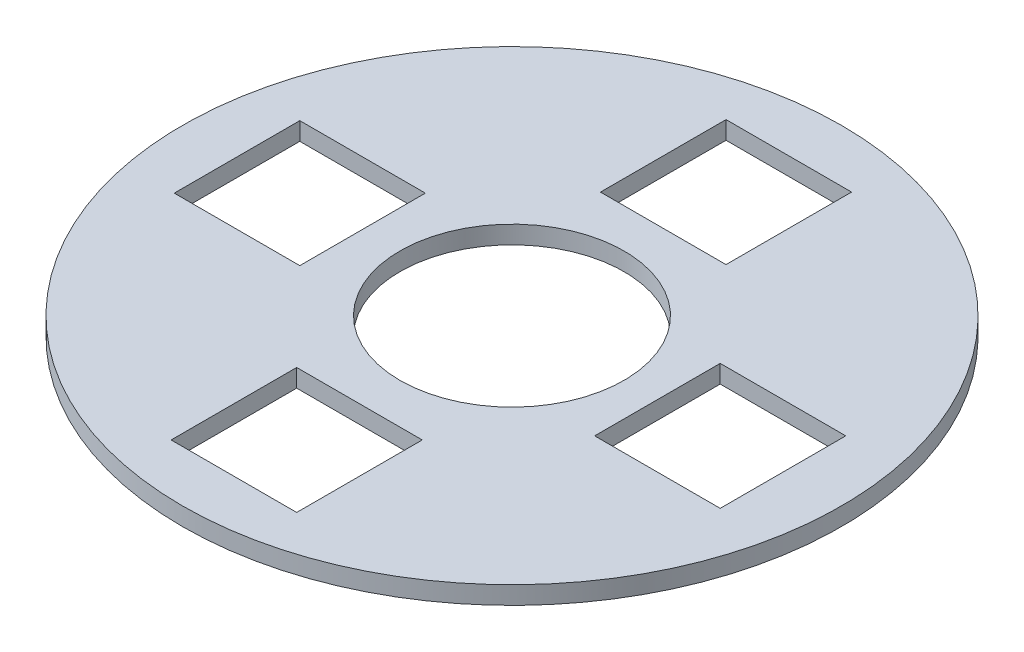
ISO-10303-21;
HEADER;
FILE_DESCRIPTION(('STEP AP214'),'2;1');
FILE_NAME('part.step','',(''),(''),'','','');
FILE_SCHEMA(('AUTOMOTIVE_DESIGN { 1 0 10303 214 1 1 1 1 }'));
ENDSEC;
DATA;
#1=APPLICATION_CONTEXT('core data for automotive mechanical design processes');
#2=APPLICATION_PROTOCOL_DEFINITION('international standard','automotive_design',2000,#1);
#3=PRODUCT_CONTEXT('',#1,'mechanical');
#4=PRODUCT('Part','Part','',(#3));
#5=PRODUCT_RELATED_PRODUCT_CATEGORY('part','',(#4));
#6=PRODUCT_DEFINITION_FORMATION('','',#4);
#7=PRODUCT_DEFINITION_CONTEXT('part definition',#1,'design');
#8=PRODUCT_DEFINITION('design','',#6,#7);
#9=PRODUCT_DEFINITION_SHAPE('','',#8);
#10=(LENGTH_UNIT() NAMED_UNIT(*) SI_UNIT(.MILLI.,.METRE.));
#11=(NAMED_UNIT(*) PLANE_ANGLE_UNIT() SI_UNIT($,.RADIAN.));
#12=(NAMED_UNIT(*) SI_UNIT($,.STERADIAN.) SOLID_ANGLE_UNIT());
#13=UNCERTAINTY_MEASURE_WITH_UNIT(LENGTH_MEASURE(1.E-05),#10,'distance_accuracy_value','');
#14=(GEOMETRIC_REPRESENTATION_CONTEXT(3) GLOBAL_UNCERTAINTY_ASSIGNED_CONTEXT((#13)) GLOBAL_UNIT_ASSIGNED_CONTEXT((#10,
#11,#12)) REPRESENTATION_CONTEXT('',''));
#15=CARTESIAN_POINT('',(0.,0.,0.));
#16=DIRECTION('',(0.,0.,1.));
#17=DIRECTION('',(1.,0.,0.));
#18=AXIS2_PLACEMENT_3D('',#15,#16,#17);
#19=CARTESIAN_POINT('',(0.,2.,0.));
#20=DIRECTION('',(0.,1.,0.));
#21=DIRECTION('',(0.,0.,1.));
#22=AXIS2_PLACEMENT_3D('',#19,#20,#21);
#23=PLANE('',#22);
#24=DIRECTION('',(-1.,0.,0.));
#25=VECTOR('',#24,1.);
#26=CARTESIAN_POINT('',(16.2180779594355,2.,-7.));
#27=LINE('',#26,#25);
#28=CARTESIAN_POINT('',(30.2180779594355,2.,-7.));
#29=VERTEX_POINT('',#28);
#30=CARTESIAN_POINT('',(16.2180779594355,2.,-7.));
#31=VERTEX_POINT('',#30);
#32=EDGE_CURVE('E171',#29,#31,#27,.T.);
#33=ORIENTED_EDGE('',*,*,#32,.F.);
#34=DIRECTION('',(0.,0.,-1.));
#35=VECTOR('',#34,1.);
#36=CARTESIAN_POINT('',(30.2180779594355,2.,-7.));
#37=LINE('',#36,#35);
#38=CARTESIAN_POINT('',(30.2180779594355,2.,7.));
#39=VERTEX_POINT('',#38);
#40=EDGE_CURVE('E224',#39,#29,#37,.T.);
#41=ORIENTED_EDGE('',*,*,#40,.F.);
#42=DIRECTION('',(1.,0.,0.));
#43=VECTOR('',#42,1.);
#44=CARTESIAN_POINT('',(30.2180779594355,2.,7.));
#45=LINE('',#44,#43);
#46=CARTESIAN_POINT('',(16.2180779594355,2.,7.));
#47=VERTEX_POINT('',#46);
#48=EDGE_CURVE('E240',#47,#39,#45,.T.);
#49=ORIENTED_EDGE('',*,*,#48,.F.);
#50=DIRECTION('',(0.,0.,1.));
#51=VECTOR('',#50,1.);
#52=CARTESIAN_POINT('',(16.2180779594355,2.,-7.));
#53=LINE('',#52,#51);
#54=EDGE_CURVE('E233',#31,#47,#53,.T.);
#55=ORIENTED_EDGE('',*,*,#54,.F.);
#56=EDGE_LOOP('',(#33,#41,#49,#55));
#57=FACE_BOUND('',#56,.T.);
#58=CARTESIAN_POINT('',(0.,2.,0.));
#59=DIRECTION('',(0.,1.,0.));
#60=DIRECTION('',(0.,0.,1.));
#61=AXIS2_PLACEMENT_3D('',#58,#59,#60);
#62=CIRCLE('',#61,12.5);
#63=CARTESIAN_POINT('',(0.,2.,12.5));
#64=VERTEX_POINT('',#63);
#65=EDGE_CURVE('E285',#64,#64,#62,.T.);
#66=ORIENTED_EDGE('',*,*,#65,.F.);
#67=EDGE_LOOP('',(#66));
#68=FACE_BOUND('',#67,.T.);
#69=CARTESIAN_POINT('',(0.,2.,0.));
#70=DIRECTION('',(0.,1.,0.));
#71=DIRECTION('',(0.,0.,1.));
#72=AXIS2_PLACEMENT_3D('',#69,#70,#71);
#73=CIRCLE('',#72,36.75);
#74=CARTESIAN_POINT('',(0.,2.,36.75));
#75=VERTEX_POINT('',#74);
#76=EDGE_CURVE('E11',#75,#75,#73,.T.);
#77=ORIENTED_EDGE('',*,*,#76,.T.);
#78=EDGE_LOOP('',(#77));
#79=FACE_BOUND('',#78,.T.);
#80=DIRECTION('',(0.,0.,1.));
#81=VECTOR('',#80,1.);
#82=CARTESIAN_POINT('',(-30.6636197756866,2.,0.));
#83=LINE('',#82,#81);
#84=CARTESIAN_POINT('',(-30.6636197756866,2.,-7.));
#85=VERTEX_POINT('',#84);
#86=CARTESIAN_POINT('',(-30.6636197756866,2.,7.));
#87=VERTEX_POINT('',#86);
#88=EDGE_CURVE('E243',#85,#87,#83,.T.);
#89=ORIENTED_EDGE('',*,*,#88,.F.);
#90=DIRECTION('',(1.,0.,0.));
#91=VECTOR('',#90,1.);
#92=CARTESIAN_POINT('',(-30.6636197756866,2.,-7.));
#93=LINE('',#92,#91);
#94=CARTESIAN_POINT('',(-16.6636197756866,2.,-7.));
#95=VERTEX_POINT('',#94);
#96=EDGE_CURVE('E254',#85,#95,#93,.T.);
#97=ORIENTED_EDGE('',*,*,#96,.T.);
#98=DIRECTION('',(0.,0.,1.));
#99=VECTOR('',#98,1.);
#100=CARTESIAN_POINT('',(-16.6636197756866,2.,-7.));
#101=LINE('',#100,#99);
#102=CARTESIAN_POINT('',(-16.6636197756866,2.,7.));
#103=VERTEX_POINT('',#102);
#104=EDGE_CURVE('E268',#95,#103,#101,.T.);
#105=ORIENTED_EDGE('',*,*,#104,.T.);
#106=DIRECTION('',(-1.,0.,0.));
#107=VECTOR('',#106,1.);
#108=CARTESIAN_POINT('',(-16.6636197756866,2.,7.));
#109=LINE('',#108,#107);
#110=EDGE_CURVE('E264',#103,#87,#109,.T.);
#111=ORIENTED_EDGE('',*,*,#110,.T.);
#112=EDGE_LOOP('',(#89,#97,#105,#111));
#113=FACE_BOUND('',#112,.T.);
#114=DIRECTION('',(0.,0.,-1.));
#115=VECTOR('',#114,1.);
#116=CARTESIAN_POINT('',(7.,2.,17.0102741767551));
#117=LINE('',#116,#115);
#118=CARTESIAN_POINT('',(7.,2.,31.0102741767551));
#119=VERTEX_POINT('',#118);
#120=CARTESIAN_POINT('',(7.,2.,17.0102741767551));
#121=VERTEX_POINT('',#120);
#122=EDGE_CURVE('E216',#119,#121,#117,.T.);
#123=ORIENTED_EDGE('',*,*,#122,.F.);
#124=DIRECTION('',(1.,0.,0.));
#125=VECTOR('',#124,1.);
#126=CARTESIAN_POINT('',(0.,2.,31.0102741767551));
#127=LINE('',#126,#125);
#128=CARTESIAN_POINT('',(-7.,2.,31.0102741767551));
#129=VERTEX_POINT('',#128);
#130=EDGE_CURVE('E202',#129,#119,#127,.T.);
#131=ORIENTED_EDGE('',*,*,#130,.F.);
#132=DIRECTION('',(0.,0.,1.));
#133=VECTOR('',#132,1.);
#134=CARTESIAN_POINT('',(-7.,2.,31.0102741767551));
#135=LINE('',#134,#133);
#136=CARTESIAN_POINT('',(-7.,2.,17.0102741767551));
#137=VERTEX_POINT('',#136);
#138=EDGE_CURVE('E199',#137,#129,#135,.T.);
#139=ORIENTED_EDGE('',*,*,#138,.F.);
#140=DIRECTION('',(-1.,0.,0.));
#141=VECTOR('',#140,1.);
#142=CARTESIAN_POINT('',(-7.,2.,17.0102741767551));
#143=LINE('',#142,#141);
#144=EDGE_CURVE('E212',#121,#137,#143,.T.);
#145=ORIENTED_EDGE('',*,*,#144,.F.);
#146=EDGE_LOOP('',(#123,#131,#139,#145));
#147=FACE_BOUND('',#146,.T.);
#148=DIRECTION('',(0.,0.,1.));
#149=VECTOR('',#148,1.);
#150=CARTESIAN_POINT('',(-7.,2.,-30.8680724569667));
#151=LINE('',#150,#149);
#152=CARTESIAN_POINT('',(-7.,2.,-30.8680724569667));
#153=VERTEX_POINT('',#152);
#154=CARTESIAN_POINT('',(-7.,2.,-16.8643853732871));
#155=VERTEX_POINT('',#154);
#156=EDGE_CURVE('E165',#153,#155,#151,.T.);
#157=ORIENTED_EDGE('',*,*,#156,.F.);
#158=DIRECTION('',(-1.,0.,0.));
#159=VECTOR('',#158,1.);
#160=CARTESIAN_POINT('',(0.,2.,-30.8680724569667));
#161=LINE('',#160,#159);
#162=CARTESIAN_POINT('',(6.9999979586546,2.,-30.8680724569667));
#163=VERTEX_POINT('',#162);
#164=EDGE_CURVE('E155',#163,#153,#161,.T.);
#165=ORIENTED_EDGE('',*,*,#164,.F.);
#166=DIRECTION('',(0.,0.,-1.));
#167=VECTOR('',#166,1.);
#168=CARTESIAN_POINT('',(6.9999979586546,2.,-16.8643853732871));
#169=LINE('',#168,#167);
#170=CARTESIAN_POINT('',(6.9999979586546,2.,-16.8643853732871));
#171=VERTEX_POINT('',#170);
#172=EDGE_CURVE('E180',#171,#163,#169,.T.);
#173=ORIENTED_EDGE('',*,*,#172,.F.);
#174=DIRECTION('',(1.,0.,0.));
#175=VECTOR('',#174,1.);
#176=CARTESIAN_POINT('',(-7.,2.,-16.8643853732871));
#177=LINE('',#176,#175);
#178=EDGE_CURVE('E174',#155,#171,#177,.T.);
#179=ORIENTED_EDGE('',*,*,#178,.F.);
#180=EDGE_LOOP('',(#157,#165,#173,#179));
#181=FACE_BOUND('',#180,.T.);
#182=ADVANCED_FACE('F39',(#57,#68,#79,#113,#147,#181),#23,.T.);
#183=CARTESIAN_POINT('',(0.,0.,0.));
#184=DIRECTION('',(0.,1.,0.));
#185=DIRECTION('',(0.,0.,1.));
#186=AXIS2_PLACEMENT_3D('',#183,#184,#185);
#187=PLANE('',#186);
#188=DIRECTION('',(1.,0.,0.));
#189=VECTOR('',#188,1.);
#190=CARTESIAN_POINT('',(0.,0.,31.0102741767551));
#191=LINE('',#190,#189);
#192=CARTESIAN_POINT('',(-7.,0.,31.0102741767551));
#193=VERTEX_POINT('',#192);
#194=CARTESIAN_POINT('',(7.,0.,31.0102741767551));
#195=VERTEX_POINT('',#194);
#196=EDGE_CURVE('E181',#193,#195,#191,.T.);
#197=ORIENTED_EDGE('',*,*,#196,.T.);
#198=DIRECTION('',(0.,0.,-1.));
#199=VECTOR('',#198,1.);
#200=CARTESIAN_POINT('',(7.,0.,17.0102741767551));
#201=LINE('',#200,#199);
#202=CARTESIAN_POINT('',(7.,0.,17.0102741767551));
#203=VERTEX_POINT('',#202);
#204=EDGE_CURVE('E208',#195,#203,#201,.T.);
#205=ORIENTED_EDGE('',*,*,#204,.T.);
#206=DIRECTION('',(-1.,0.,0.));
#207=VECTOR('',#206,1.);
#208=CARTESIAN_POINT('',(-7.,0.,17.0102741767551));
#209=LINE('',#208,#207);
#210=CARTESIAN_POINT('',(-7.,0.,17.0102741767551));
#211=VERTEX_POINT('',#210);
#212=EDGE_CURVE('E204',#203,#211,#209,.T.);
#213=ORIENTED_EDGE('',*,*,#212,.T.);
#214=DIRECTION('',(0.,0.,1.));
#215=VECTOR('',#214,1.);
#216=CARTESIAN_POINT('',(-7.,0.,31.0102741767551));
#217=LINE('',#216,#215);
#218=EDGE_CURVE('E203',#211,#193,#217,.T.);
#219=ORIENTED_EDGE('',*,*,#218,.T.);
#220=EDGE_LOOP('',(#197,#205,#213,#219));
#221=FACE_BOUND('',#220,.T.);
#222=DIRECTION('',(0.,0.,-1.));
#223=VECTOR('',#222,1.);
#224=CARTESIAN_POINT('',(30.2180779594355,0.,-7.));
#225=LINE('',#224,#223);
#226=CARTESIAN_POINT('',(30.2180779594355,0.,7.));
#227=VERTEX_POINT('',#226);
#228=CARTESIAN_POINT('',(30.2180779594355,0.,-7.));
#229=VERTEX_POINT('',#228);
#230=EDGE_CURVE('E228',#227,#229,#225,.T.);
#231=ORIENTED_EDGE('',*,*,#230,.T.);
#232=DIRECTION('',(-1.,0.,0.));
#233=VECTOR('',#232,1.);
#234=CARTESIAN_POINT('',(16.2180779594355,0.,-7.));
#235=LINE('',#234,#233);
#236=CARTESIAN_POINT('',(16.2180779594355,0.,-7.));
#237=VERTEX_POINT('',#236);
#238=EDGE_CURVE('E218',#229,#237,#235,.T.);
#239=ORIENTED_EDGE('',*,*,#238,.T.);
#240=DIRECTION('',(0.,0.,1.));
#241=VECTOR('',#240,1.);
#242=CARTESIAN_POINT('',(16.2180779594355,0.,-7.));
#243=LINE('',#242,#241);
#244=CARTESIAN_POINT('',(16.2180779594355,0.,7.));
#245=VERTEX_POINT('',#244);
#246=EDGE_CURVE('E225',#237,#245,#243,.T.);
#247=ORIENTED_EDGE('',*,*,#246,.T.);
#248=DIRECTION('',(1.,0.,0.));
#249=VECTOR('',#248,1.);
#250=CARTESIAN_POINT('',(30.2180779594355,0.,7.));
#251=LINE('',#250,#249);
#252=EDGE_CURVE('E226',#245,#227,#251,.T.);
#253=ORIENTED_EDGE('',*,*,#252,.T.);
#254=EDGE_LOOP('',(#231,#239,#247,#253));
#255=FACE_BOUND('',#254,.T.);
#256=CARTESIAN_POINT('',(0.,0.,0.));
#257=DIRECTION('',(0.,1.,0.));
#258=DIRECTION('',(0.,0.,1.));
#259=AXIS2_PLACEMENT_3D('',#256,#257,#258);
#260=CIRCLE('',#259,36.75);
#261=CARTESIAN_POINT('',(0.,0.,36.75));
#262=VERTEX_POINT('',#261);
#263=EDGE_CURVE('E43',#262,#262,#260,.T.);
#264=ORIENTED_EDGE('',*,*,#263,.F.);
#265=EDGE_LOOP('',(#264));
#266=FACE_BOUND('',#265,.T.);
#267=CARTESIAN_POINT('',(0.,0.,0.));
#268=DIRECTION('',(0.,1.,0.));
#269=DIRECTION('',(0.,0.,1.));
#270=AXIS2_PLACEMENT_3D('',#267,#268,#269);
#271=CIRCLE('',#270,12.5);
#272=CARTESIAN_POINT('',(0.,0.,12.5));
#273=VERTEX_POINT('',#272);
#274=EDGE_CURVE('E277',#273,#273,#271,.T.);
#275=ORIENTED_EDGE('',*,*,#274,.T.);
#276=EDGE_LOOP('',(#275));
#277=FACE_BOUND('',#276,.T.);
#278=DIRECTION('',(1.,0.,0.));
#279=VECTOR('',#278,1.);
#280=CARTESIAN_POINT('',(-30.6636197756866,0.,-7.));
#281=LINE('',#280,#279);
#282=CARTESIAN_POINT('',(-30.6636197756866,0.,-7.));
#283=VERTEX_POINT('',#282);
#284=CARTESIAN_POINT('',(-16.6636197756866,0.,-7.));
#285=VERTEX_POINT('',#284);
#286=EDGE_CURVE('E257',#283,#285,#281,.T.);
#287=ORIENTED_EDGE('',*,*,#286,.F.);
#288=DIRECTION('',(0.,0.,1.));
#289=VECTOR('',#288,1.);
#290=CARTESIAN_POINT('',(-30.6636197756866,0.,-7.));
#291=LINE('',#290,#289);
#292=CARTESIAN_POINT('',(-30.6636197756866,0.,7.));
#293=VERTEX_POINT('',#292);
#294=EDGE_CURVE('E253',#283,#293,#291,.T.);
#295=ORIENTED_EDGE('',*,*,#294,.T.);
#296=DIRECTION('',(-1.,0.,0.));
#297=VECTOR('',#296,1.);
#298=CARTESIAN_POINT('',(-16.6636197756866,0.,7.));
#299=LINE('',#298,#297);
#300=CARTESIAN_POINT('',(-16.6636197756866,0.,7.));
#301=VERTEX_POINT('',#300);
#302=EDGE_CURVE('E255',#301,#293,#299,.T.);
#303=ORIENTED_EDGE('',*,*,#302,.F.);
#304=DIRECTION('',(0.,0.,1.));
#305=VECTOR('',#304,1.);
#306=CARTESIAN_POINT('',(-16.6636197756866,0.,-7.));
#307=LINE('',#306,#305);
#308=EDGE_CURVE('E256',#285,#301,#307,.T.);
#309=ORIENTED_EDGE('',*,*,#308,.F.);
#310=EDGE_LOOP('',(#287,#295,#303,#309));
#311=FACE_BOUND('',#310,.T.);
#312=DIRECTION('',(-1.,0.,0.));
#313=VECTOR('',#312,1.);
#314=CARTESIAN_POINT('',(0.,0.,-30.8680724569667));
#315=LINE('',#314,#313);
#316=CARTESIAN_POINT('',(6.9999979586546,0.,-30.8680724569667));
#317=VERTEX_POINT('',#316);
#318=CARTESIAN_POINT('',(-7.,0.,-30.8680724569667));
#319=VERTEX_POINT('',#318);
#320=EDGE_CURVE('E182',#317,#319,#315,.T.);
#321=ORIENTED_EDGE('',*,*,#320,.T.);
#322=DIRECTION('',(0.,0.,1.));
#323=VECTOR('',#322,1.);
#324=CARTESIAN_POINT('',(-7.,0.,-30.8680724569667));
#325=LINE('',#324,#323);
#326=CARTESIAN_POINT('',(-7.,0.,-16.8643853732871));
#327=VERTEX_POINT('',#326);
#328=EDGE_CURVE('E166',#319,#327,#325,.T.);
#329=ORIENTED_EDGE('',*,*,#328,.T.);
#330=DIRECTION('',(1.,0.,0.));
#331=VECTOR('',#330,1.);
#332=CARTESIAN_POINT('',(-7.,0.,-16.8643853732871));
#333=LINE('',#332,#331);
#334=CARTESIAN_POINT('',(6.9999979586546,0.,-16.8643853732871));
#335=VERTEX_POINT('',#334);
#336=EDGE_CURVE('E183',#327,#335,#333,.T.);
#337=ORIENTED_EDGE('',*,*,#336,.T.);
#338=DIRECTION('',(0.,0.,-1.));
#339=VECTOR('',#338,1.);
#340=CARTESIAN_POINT('',(6.9999979586546,0.,-16.8643853732871));
#341=LINE('',#340,#339);
#342=EDGE_CURVE('E162',#335,#317,#341,.T.);
#343=ORIENTED_EDGE('',*,*,#342,.T.);
#344=EDGE_LOOP('',(#321,#329,#337,#343));
#345=FACE_BOUND('',#344,.T.);
#346=ADVANCED_FACE('F287',(#221,#255,#266,#277,#311,#345),#187,.F.);
#347=CARTESIAN_POINT('',(0.,2.,0.));
#348=DIRECTION('',(0.,-1.,0.));
#349=DIRECTION('',(0.,0.,-1.));
#350=AXIS2_PLACEMENT_3D('',#347,#348,#349);
#351=CYLINDRICAL_SURFACE('',#350,36.75);
#352=ORIENTED_EDGE('',*,*,#76,.F.);
#353=EDGE_LOOP('',(#352));
#354=FACE_BOUND('',#353,.T.);
#355=ORIENTED_EDGE('',*,*,#263,.T.);
#356=EDGE_LOOP('',(#355));
#357=FACE_BOUND('',#356,.T.);
#358=ADVANCED_FACE('F41',(#354,#357),#351,.T.);
#359=CARTESIAN_POINT('',(0.,2.,0.));
#360=DIRECTION('',(0.,-1.,0.));
#361=DIRECTION('',(0.,0.,-1.));
#362=AXIS2_PLACEMENT_3D('',#359,#360,#361);
#363=CYLINDRICAL_SURFACE('',#362,12.5);
#364=ORIENTED_EDGE('',*,*,#65,.T.);
#365=EDGE_LOOP('',(#364));
#366=FACE_BOUND('',#365,.T.);
#367=ORIENTED_EDGE('',*,*,#274,.F.);
#368=EDGE_LOOP('',(#367));
#369=FACE_BOUND('',#368,.T.);
#370=ADVANCED_FACE('F292',(#366,#369),#363,.F.);
#371=CARTESIAN_POINT('',(-30.6636197756866,0.,-7.));
#372=DIRECTION('',(0.,0.,1.));
#373=DIRECTION('',(1.,0.,0.));
#374=AXIS2_PLACEMENT_3D('',#371,#372,#373);
#375=PLANE('',#374);
#376=ORIENTED_EDGE('',*,*,#96,.F.);
#377=DIRECTION('',(0.,1.,0.));
#378=VECTOR('',#377,1.);
#379=CARTESIAN_POINT('',(-30.6636197756866,0.,-7.));
#380=LINE('',#379,#378);
#381=EDGE_CURVE('E272',#283,#85,#380,.T.);
#382=ORIENTED_EDGE('',*,*,#381,.F.);
#383=ORIENTED_EDGE('',*,*,#286,.T.);
#384=DIRECTION('',(0.,1.,0.));
#385=VECTOR('',#384,1.);
#386=CARTESIAN_POINT('',(-16.6636197756866,0.,-7.));
#387=LINE('',#386,#385);
#388=EDGE_CURVE('E280',#285,#95,#387,.T.);
#389=ORIENTED_EDGE('',*,*,#388,.T.);
#390=EDGE_LOOP('',(#376,#382,#383,#389));
#391=FACE_BOUND('',#390,.T.);
#392=ADVANCED_FACE('F291',(#391),#375,.T.);
#393=CARTESIAN_POINT('',(-16.6636197756866,0.,-7.));
#394=DIRECTION('',(-1.,0.,0.));
#395=DIRECTION('',(0.,0.,1.));
#396=AXIS2_PLACEMENT_3D('',#393,#394,#395);
#397=PLANE('',#396);
#398=ORIENTED_EDGE('',*,*,#104,.F.);
#399=ORIENTED_EDGE('',*,*,#388,.F.);
#400=ORIENTED_EDGE('',*,*,#308,.T.);
#401=DIRECTION('',(0.,1.,0.));
#402=VECTOR('',#401,1.);
#403=CARTESIAN_POINT('',(-16.6636197756866,0.,7.));
#404=LINE('',#403,#402);
#405=EDGE_CURVE('E276',#301,#103,#404,.T.);
#406=ORIENTED_EDGE('',*,*,#405,.T.);
#407=EDGE_LOOP('',(#398,#399,#400,#406));
#408=FACE_BOUND('',#407,.T.);
#409=ADVANCED_FACE('F299',(#408),#397,.T.);
#410=CARTESIAN_POINT('',(-16.6636197756866,0.,7.));
#411=DIRECTION('',(0.,0.,-1.));
#412=DIRECTION('',(-1.,0.,0.));
#413=AXIS2_PLACEMENT_3D('',#410,#411,#412);
#414=PLANE('',#413);
#415=ORIENTED_EDGE('',*,*,#110,.F.);
#416=ORIENTED_EDGE('',*,*,#405,.F.);
#417=ORIENTED_EDGE('',*,*,#302,.T.);
#418=DIRECTION('',(0.,1.,0.));
#419=VECTOR('',#418,1.);
#420=CARTESIAN_POINT('',(-30.6636197756866,0.,7.));
#421=LINE('',#420,#419);
#422=EDGE_CURVE('E265',#293,#87,#421,.T.);
#423=ORIENTED_EDGE('',*,*,#422,.T.);
#424=EDGE_LOOP('',(#415,#416,#417,#423));
#425=FACE_BOUND('',#424,.T.);
#426=ADVANCED_FACE('F369',(#425),#414,.T.);
#427=CARTESIAN_POINT('',(-30.6636197756866,0.,0.));
#428=DIRECTION('',(-1.,0.,0.));
#429=DIRECTION('',(0.,0.,1.));
#430=AXIS2_PLACEMENT_3D('',#427,#428,#429);
#431=PLANE('',#430);
#432=ORIENTED_EDGE('',*,*,#88,.T.);
#433=ORIENTED_EDGE('',*,*,#422,.F.);
#434=ORIENTED_EDGE('',*,*,#294,.F.);
#435=ORIENTED_EDGE('',*,*,#381,.T.);
#436=EDGE_LOOP('',(#432,#433,#434,#435));
#437=FACE_BOUND('',#436,.T.);
#438=ADVANCED_FACE('F365',(#437),#431,.F.);
#439=CARTESIAN_POINT('',(16.2180779594355,0.,-7.));
#440=DIRECTION('',(0.,0.,-1.));
#441=DIRECTION('',(-1.,0.,0.));
#442=AXIS2_PLACEMENT_3D('',#439,#440,#441);
#443=PLANE('',#442);
#444=ORIENTED_EDGE('',*,*,#32,.T.);
#445=DIRECTION('',(0.,1.,0.));
#446=VECTOR('',#445,1.);
#447=CARTESIAN_POINT('',(16.2180779594355,0.,-7.));
#448=LINE('',#447,#446);
#449=EDGE_CURVE('E235',#237,#31,#448,.T.);
#450=ORIENTED_EDGE('',*,*,#449,.F.);
#451=ORIENTED_EDGE('',*,*,#238,.F.);
#452=DIRECTION('',(0.,1.,0.));
#453=VECTOR('',#452,1.);
#454=CARTESIAN_POINT('',(30.2180779594355,0.,-7.));
#455=LINE('',#454,#453);
#456=EDGE_CURVE('E245',#229,#29,#455,.T.);
#457=ORIENTED_EDGE('',*,*,#456,.T.);
#458=EDGE_LOOP('',(#444,#450,#451,#457));
#459=FACE_BOUND('',#458,.T.);
#460=ADVANCED_FACE('F354',(#459),#443,.F.);
#461=CARTESIAN_POINT('',(30.2180779594355,0.,-7.));
#462=DIRECTION('',(1.,0.,0.));
#463=DIRECTION('',(0.,0.,-1.));
#464=AXIS2_PLACEMENT_3D('',#461,#462,#463);
#465=PLANE('',#464);
#466=ORIENTED_EDGE('',*,*,#40,.T.);
#467=ORIENTED_EDGE('',*,*,#456,.F.);
#468=ORIENTED_EDGE('',*,*,#230,.F.);
#469=DIRECTION('',(0.,1.,0.));
#470=VECTOR('',#469,1.);
#471=CARTESIAN_POINT('',(30.2180779594355,0.,7.));
#472=LINE('',#471,#470);
#473=EDGE_CURVE('E244',#227,#39,#472,.T.);
#474=ORIENTED_EDGE('',*,*,#473,.T.);
#475=EDGE_LOOP('',(#466,#467,#468,#474));
#476=FACE_BOUND('',#475,.T.);
#477=ADVANCED_FACE('F351',(#476),#465,.F.);
#478=CARTESIAN_POINT('',(30.2180779594355,0.,7.));
#479=DIRECTION('',(0.,0.,1.));
#480=DIRECTION('',(1.,0.,0.));
#481=AXIS2_PLACEMENT_3D('',#478,#479,#480);
#482=PLANE('',#481);
#483=ORIENTED_EDGE('',*,*,#48,.T.);
#484=ORIENTED_EDGE('',*,*,#473,.F.);
#485=ORIENTED_EDGE('',*,*,#252,.F.);
#486=DIRECTION('',(0.,1.,0.));
#487=VECTOR('',#486,1.);
#488=CARTESIAN_POINT('',(16.2180779594355,0.,7.));
#489=LINE('',#488,#487);
#490=EDGE_CURVE('E250',#245,#47,#489,.T.);
#491=ORIENTED_EDGE('',*,*,#490,.T.);
#492=EDGE_LOOP('',(#483,#484,#485,#491));
#493=FACE_BOUND('',#492,.T.);
#494=ADVANCED_FACE('F353',(#493),#482,.F.);
#495=CARTESIAN_POINT('',(16.2180779594355,0.,-7.));
#496=DIRECTION('',(-1.,0.,0.));
#497=DIRECTION('',(0.,0.,1.));
#498=AXIS2_PLACEMENT_3D('',#495,#496,#497);
#499=PLANE('',#498);
#500=ORIENTED_EDGE('',*,*,#54,.T.);
#501=ORIENTED_EDGE('',*,*,#490,.F.);
#502=ORIENTED_EDGE('',*,*,#246,.F.);
#503=ORIENTED_EDGE('',*,*,#449,.T.);
#504=EDGE_LOOP('',(#500,#501,#502,#503));
#505=FACE_BOUND('',#504,.T.);
#506=ADVANCED_FACE('F358',(#505),#499,.F.);
#507=CARTESIAN_POINT('',(0.,2.,31.0102741767551));
#508=DIRECTION('',(0.,0.,-1.));
#509=DIRECTION('',(-1.,0.,0.));
#510=AXIS2_PLACEMENT_3D('',#507,#508,#509);
#511=PLANE('',#510);
#512=ORIENTED_EDGE('',*,*,#196,.F.);
#513=DIRECTION('',(0.,-1.,0.));
#514=VECTOR('',#513,1.);
#515=CARTESIAN_POINT('',(-7.,2.,31.0102741767551));
#516=LINE('',#515,#514);
#517=EDGE_CURVE('E196',#129,#193,#516,.T.);
#518=ORIENTED_EDGE('',*,*,#517,.F.);
#519=ORIENTED_EDGE('',*,*,#130,.T.);
#520=DIRECTION('',(0.,-1.,0.));
#521=VECTOR('',#520,1.);
#522=CARTESIAN_POINT('',(7.,2.,31.0102741767551));
#523=LINE('',#522,#521);
#524=EDGE_CURVE('E192',#119,#195,#523,.T.);
#525=ORIENTED_EDGE('',*,*,#524,.T.);
#526=EDGE_LOOP('',(#512,#518,#519,#525));
#527=FACE_BOUND('',#526,.T.);
#528=ADVANCED_FACE('F338',(#527),#511,.T.);
#529=CARTESIAN_POINT('',(7.,2.,17.0102741767551));
#530=DIRECTION('',(-1.,0.,0.));
#531=DIRECTION('',(0.,0.,1.));
#532=AXIS2_PLACEMENT_3D('',#529,#530,#531);
#533=PLANE('',#532);
#534=ORIENTED_EDGE('',*,*,#204,.F.);
#535=ORIENTED_EDGE('',*,*,#524,.F.);
#536=ORIENTED_EDGE('',*,*,#122,.T.);
#537=DIRECTION('',(0.,-1.,0.));
#538=VECTOR('',#537,1.);
#539=CARTESIAN_POINT('',(7.,2.,17.0102741767551));
#540=LINE('',#539,#538);
#541=EDGE_CURVE('E194',#121,#203,#540,.T.);
#542=ORIENTED_EDGE('',*,*,#541,.T.);
#543=EDGE_LOOP('',(#534,#535,#536,#542));
#544=FACE_BOUND('',#543,.T.);
#545=ADVANCED_FACE('F332',(#544),#533,.T.);
#546=CARTESIAN_POINT('',(-7.,2.,17.0102741767551));
#547=DIRECTION('',(0.,0.,1.));
#548=DIRECTION('',(1.,0.,0.));
#549=AXIS2_PLACEMENT_3D('',#546,#547,#548);
#550=PLANE('',#549);
#551=ORIENTED_EDGE('',*,*,#212,.F.);
#552=ORIENTED_EDGE('',*,*,#541,.F.);
#553=ORIENTED_EDGE('',*,*,#144,.T.);
#554=DIRECTION('',(0.,-1.,0.));
#555=VECTOR('',#554,1.);
#556=CARTESIAN_POINT('',(-7.,2.,17.0102741767551));
#557=LINE('',#556,#555);
#558=EDGE_CURVE('E65',#137,#211,#557,.T.);
#559=ORIENTED_EDGE('',*,*,#558,.T.);
#560=EDGE_LOOP('',(#551,#552,#553,#559));
#561=FACE_BOUND('',#560,.T.);
#562=ADVANCED_FACE('F331',(#561),#550,.T.);
#563=CARTESIAN_POINT('',(-7.,2.,31.0102741767551));
#564=DIRECTION('',(1.,0.,0.));
#565=DIRECTION('',(0.,0.,-1.));
#566=AXIS2_PLACEMENT_3D('',#563,#564,#565);
#567=PLANE('',#566);
#568=ORIENTED_EDGE('',*,*,#218,.F.);
#569=ORIENTED_EDGE('',*,*,#558,.F.);
#570=ORIENTED_EDGE('',*,*,#138,.T.);
#571=ORIENTED_EDGE('',*,*,#517,.T.);
#572=EDGE_LOOP('',(#568,#569,#570,#571));
#573=FACE_BOUND('',#572,.T.);
#574=ADVANCED_FACE('F339',(#573),#567,.T.);
#575=CARTESIAN_POINT('',(0.,2.,-30.8680724569667));
#576=DIRECTION('',(0.,0.,1.));
#577=DIRECTION('',(1.,0.,0.));
#578=AXIS2_PLACEMENT_3D('',#575,#576,#577);
#579=PLANE('',#578);
#580=ORIENTED_EDGE('',*,*,#320,.F.);
#581=DIRECTION('',(0.,-1.,0.));
#582=VECTOR('',#581,1.);
#583=CARTESIAN_POINT('',(6.9999979586546,2.,-30.8680724569667));
#584=LINE('',#583,#582);
#585=EDGE_CURVE('E158',#163,#317,#584,.T.);
#586=ORIENTED_EDGE('',*,*,#585,.F.);
#587=ORIENTED_EDGE('',*,*,#164,.T.);
#588=DIRECTION('',(0.,-1.,0.));
#589=VECTOR('',#588,1.);
#590=CARTESIAN_POINT('',(-7.,2.,-30.8680724569667));
#591=LINE('',#590,#589);
#592=EDGE_CURVE('E156',#153,#319,#591,.T.);
#593=ORIENTED_EDGE('',*,*,#592,.T.);
#594=EDGE_LOOP('',(#580,#586,#587,#593));
#595=FACE_BOUND('',#594,.T.);
#596=ADVANCED_FACE('F154',(#595),#579,.T.);
#597=CARTESIAN_POINT('',(-7.,2.,-30.8680724569667));
#598=DIRECTION('',(1.,0.,0.));
#599=DIRECTION('',(0.,0.,-1.));
#600=AXIS2_PLACEMENT_3D('',#597,#598,#599);
#601=PLANE('',#600);
#602=ORIENTED_EDGE('',*,*,#328,.F.);
#603=ORIENTED_EDGE('',*,*,#592,.F.);
#604=ORIENTED_EDGE('',*,*,#156,.T.);
#605=DIRECTION('',(0.,-1.,0.));
#606=VECTOR('',#605,1.);
#607=CARTESIAN_POINT('',(-7.,2.,-16.8643853732871));
#608=LINE('',#607,#606);
#609=EDGE_CURVE('E175',#155,#327,#608,.T.);
#610=ORIENTED_EDGE('',*,*,#609,.T.);
#611=EDGE_LOOP('',(#602,#603,#604,#610));
#612=FACE_BOUND('',#611,.T.);
#613=ADVANCED_FACE('F167',(#612),#601,.T.);
#614=CARTESIAN_POINT('',(-7.,2.,-16.8643853732871));
#615=DIRECTION('',(0.,0.,-1.));
#616=DIRECTION('',(-1.,0.,0.));
#617=AXIS2_PLACEMENT_3D('',#614,#615,#616);
#618=PLANE('',#617);
#619=ORIENTED_EDGE('',*,*,#336,.F.);
#620=ORIENTED_EDGE('',*,*,#609,.F.);
#621=ORIENTED_EDGE('',*,*,#178,.T.);
#622=DIRECTION('',(0.,-1.,0.));
#623=VECTOR('',#622,1.);
#624=CARTESIAN_POINT('',(6.9999979586546,2.,-16.8643853732871));
#625=LINE('',#624,#623);
#626=EDGE_CURVE('E53',#171,#335,#625,.T.);
#627=ORIENTED_EDGE('',*,*,#626,.T.);
#628=EDGE_LOOP('',(#619,#620,#621,#627));
#629=FACE_BOUND('',#628,.T.);
#630=ADVANCED_FACE('F386',(#629),#618,.T.);
#631=CARTESIAN_POINT('',(6.9999979586546,2.,-16.8643853732871));
#632=DIRECTION('',(-1.,0.,0.));
#633=DIRECTION('',(0.,0.,1.));
#634=AXIS2_PLACEMENT_3D('',#631,#632,#633);
#635=PLANE('',#634);
#636=ORIENTED_EDGE('',*,*,#342,.F.);
#637=ORIENTED_EDGE('',*,*,#626,.F.);
#638=ORIENTED_EDGE('',*,*,#172,.T.);
#639=ORIENTED_EDGE('',*,*,#585,.T.);
#640=EDGE_LOOP('',(#636,#637,#638,#639));
#641=FACE_BOUND('',#640,.T.);
#642=ADVANCED_FACE('F390',(#641),#635,.T.);
#643=CLOSED_SHELL('',(#182,#346,#358,#370,#392,#409,#426,#438,#460,#477,#494,#506,#528,#545,
#562,#574,#596,#613,#630,#642));
#644=MANIFOLD_SOLID_BREP('B2',#643);
#645=ADVANCED_BREP_SHAPE_REPRESENTATION('',(#18,#644),#14);
#646=SHAPE_DEFINITION_REPRESENTATION(#9,#645);
ENDSEC;
END-ISO-10303-21;
